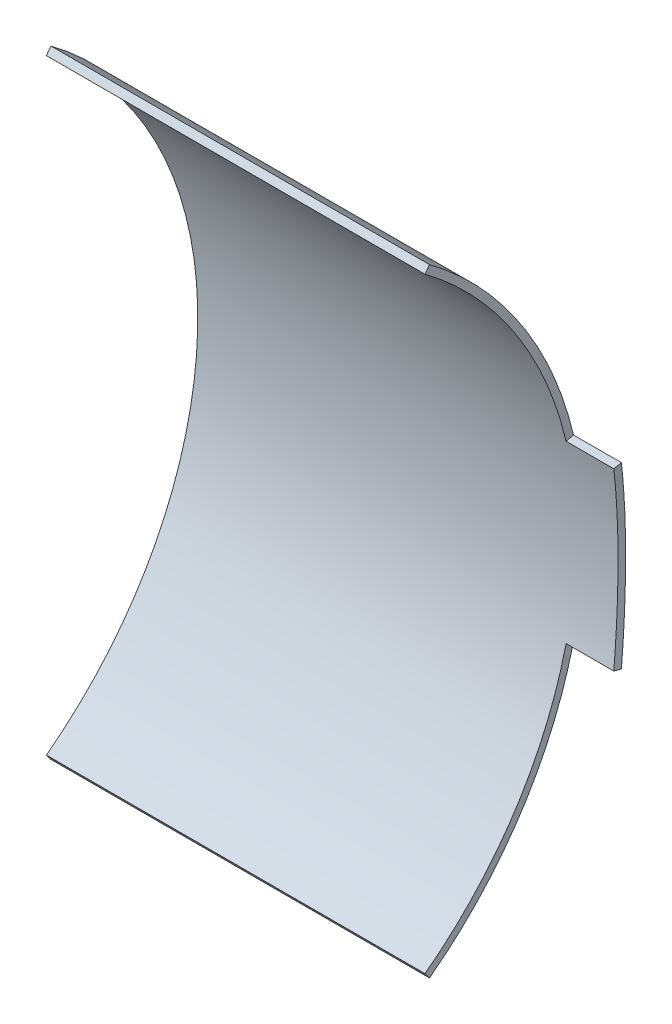
ISO-10303-21;
HEADER;
FILE_DESCRIPTION(('STEP AP214'),'2;1');
FILE_NAME('part.step','',(''),(''),'','','');
FILE_SCHEMA(('AUTOMOTIVE_DESIGN { 1 0 10303 214 1 1 1 1 }'));
ENDSEC;
DATA;
#1=APPLICATION_CONTEXT('core data for automotive mechanical design processes');
#2=APPLICATION_PROTOCOL_DEFINITION('international standard','automotive_design',2000,#1);
#3=PRODUCT_CONTEXT('',#1,'mechanical');
#4=PRODUCT('Part','Part','',(#3));
#5=PRODUCT_RELATED_PRODUCT_CATEGORY('part','',(#4));
#6=PRODUCT_DEFINITION_FORMATION('','',#4);
#7=PRODUCT_DEFINITION_CONTEXT('part definition',#1,'design');
#8=PRODUCT_DEFINITION('design','',#6,#7);
#9=PRODUCT_DEFINITION_SHAPE('','',#8);
#10=(LENGTH_UNIT() NAMED_UNIT(*) SI_UNIT(.MILLI.,.METRE.));
#11=(NAMED_UNIT(*) PLANE_ANGLE_UNIT() SI_UNIT($,.RADIAN.));
#12=(NAMED_UNIT(*) SI_UNIT($,.STERADIAN.) SOLID_ANGLE_UNIT());
#13=UNCERTAINTY_MEASURE_WITH_UNIT(LENGTH_MEASURE(1.E-05),#10,'distance_accuracy_value','');
#14=(GEOMETRIC_REPRESENTATION_CONTEXT(3) GLOBAL_UNCERTAINTY_ASSIGNED_CONTEXT((#13)) GLOBAL_UNIT_ASSIGNED_CONTEXT((#10,
#11,#12)) REPRESENTATION_CONTEXT('',''));
#15=CARTESIAN_POINT('',(0.,0.,0.));
#16=DIRECTION('',(0.,0.,1.));
#17=DIRECTION('',(1.,0.,0.));
#18=AXIS2_PLACEMENT_3D('',#15,#16,#17);
#19=CARTESIAN_POINT('',(50.,0.,0.));
#20=DIRECTION('',(-1.,0.,0.));
#21=DIRECTION('',(0.,0.,1.));
#22=AXIS2_PLACEMENT_3D('',#19,#20,#21);
#23=CYLINDRICAL_SURFACE('',#22,51.);
#24=CARTESIAN_POINT('',(0.,0.,0.));
#25=DIRECTION('',(0.999999999999989,0.,0.));
#26=DIRECTION('',(0.,0.,-0.999999999999977));
#27=AXIS2_PLACEMENT_3D('',#24,#25,#26);
#28=CIRCLE('',#27,51.);
#29=CARTESIAN_POINT('',(0.,40.7999999999999,-30.5999999999993));
#30=VERTEX_POINT('',#29);
#31=CARTESIAN_POINT('',(2.91433543964104E-13,-40.7999999999996,-30.5999999999991));
#32=VERTEX_POINT('',#31);
#33=EDGE_CURVE('E185',#30,#32,#28,.F.);
#34=ORIENTED_EDGE('',*,*,#33,.F.);
#35=DIRECTION('',(-1.,0.,0.));
#36=VECTOR('',#35,1.);
#37=CARTESIAN_POINT('',(50.0000000000001,40.7999999999999,-30.5999999999993));
#38=LINE('',#37,#36);
#39=CARTESIAN_POINT('',(50.0000000000001,40.7999999999999,-30.5999999999993));
#40=VERTEX_POINT('',#39);
#41=EDGE_CURVE('E11',#40,#30,#38,.T.);
#42=ORIENTED_EDGE('',*,*,#41,.F.);
#43=CARTESIAN_POINT('',(50.,0.,0.));
#44=DIRECTION('',(0.999999999999989,0.,0.));
#45=DIRECTION('',(0.,0.,-0.999999999999977));
#46=AXIS2_PLACEMENT_3D('',#43,#44,#45);
#47=CIRCLE('',#46,51.);
#48=CARTESIAN_POINT('',(50.0000000000007,11.8006085871643,-49.6159816689381));
#49=VERTEX_POINT('',#48);
#50=EDGE_CURVE('E58',#40,#49,#47,.F.);
#51=ORIENTED_EDGE('',*,*,#50,.T.);
#52=DIRECTION('',(-1.,0.,0.));
#53=VECTOR('',#52,1.);
#54=CARTESIAN_POINT('',(224.500651286366,11.8006085871643,-49.6159816689395));
#55=LINE('',#54,#53);
#56=CARTESIAN_POINT('',(56.3276987755479,11.8006085871643,-49.6159816689395));
#57=VERTEX_POINT('',#56);
#58=EDGE_CURVE('E147',#57,#49,#55,.T.);
#59=ORIENTED_EDGE('',*,*,#58,.F.);
#60=CARTESIAN_POINT('',(56.3276987755481,-11.8006085871644,-49.6159816689395));
#61=CARTESIAN_POINT('',(56.2421431199576,-11.1940659705682,-49.7602521474427));
#62=CARTESIAN_POINT('',(56.1628459242617,-10.5840304122179,-49.8935797907839));
#63=CARTESIAN_POINT('',(56.0171582342197,-9.35796245954004,-50.1379998242374));
#64=CARTESIAN_POINT('',(55.9507683875582,-8.74192976590719,-50.2490910985479));
#65=CARTESIAN_POINT('',(55.8312716591383,-7.50468799354155,-50.4487113181206));
#66=CARTESIAN_POINT('',(55.7781697186336,-6.88347707769742,-50.5372318704438));
#67=CARTESIAN_POINT('',(55.6855846962375,-5.63726599608254,-50.6913757109759));
#68=CARTESIAN_POINT('',(55.6461012656798,-5.01226592774009,-50.756999585395));
#69=CARTESIAN_POINT('',(55.5499154175328,-3.16134464214234,-50.9167508006822));
#70=CARTESIAN_POINT('',(55.5127607135739,-1.93137576886877,-50.978278339892));
#71=CARTESIAN_POINT('',(55.492354783328,0.52968578891808,-51.0120901535206));
#72=CARTESIAN_POINT('',(55.5090806036166,1.76077777158737,-50.9844124299102));
#73=CARTESIAN_POINT('',(55.5786656485458,3.72768868806815,-50.8689859282479));
#74=CARTESIAN_POINT('',(55.6145247443495,4.46591400384948,-50.8094792106459));
#75=CARTESIAN_POINT('',(55.7053130657657,5.93784336860939,-50.6585543397835));
#76=CARTESIAN_POINT('',(55.7602394135254,6.67154808289153,-50.5671410022323));
#77=CARTESIAN_POINT('',(55.8896183850118,8.14278758756847,-50.3513189568534));
#78=CARTESIAN_POINT('',(55.9643306769794,8.88023489819436,-50.2264711951656));
#79=CARTESIAN_POINT('',(56.1322804021036,10.3469903164566,-49.9449509305596));
#80=CARTESIAN_POINT('',(56.2255199187767,11.0762974989272,-49.788274848279));
#81=CARTESIAN_POINT('',(56.3276987755478,11.8006085871643,-49.6159816689395));
#82=B_SPLINE_CURVE_WITH_KNOTS('',3,(#60,#61,#62,#63,#64,#65,#66,#67,#68,#69,#70,#71,#72,#73,#74,
#75,#76,#77,#78,#79,#80,#81),.UNSPECIFIED.,.F.,.F.,(4,2,2,2,2,2,2,2,2,2,4),(0.,1.88779429643467,
3.77568329702008,5.66427329003176,7.55281492704589,11.2443286051451,14.9342698844242,
17.1578837929369,19.3811622334269,21.6352041159688,23.8894996249508),.UNSPECIFIED.);
#83=CARTESIAN_POINT('',(56.3276987755481,-11.8006085871644,-49.6159816689395));
#84=VERTEX_POINT('',#83);
#85=EDGE_CURVE('E160',#84,#57,#82,.T.);
#86=ORIENTED_EDGE('',*,*,#85,.F.);
#87=DIRECTION('',(-1.,0.,0.));
#88=VECTOR('',#87,1.);
#89=CARTESIAN_POINT('',(224.500651286366,-11.8006085871644,-49.6159816689395));
#90=LINE('',#89,#88);
#91=CARTESIAN_POINT('',(50.0000000000006,-11.8006085871644,-49.6159816689395));
#92=VERTEX_POINT('',#91);
#93=EDGE_CURVE('E113',#84,#92,#90,.T.);
#94=ORIENTED_EDGE('',*,*,#93,.T.);
#95=CARTESIAN_POINT('',(50.,0.,0.));
#96=DIRECTION('',(0.999999999999985,0.,0.));
#97=DIRECTION('',(0.,0.,-0.99999999999997));
#98=AXIS2_PLACEMENT_3D('',#95,#96,#97);
#99=CIRCLE('',#98,51.);
#100=CARTESIAN_POINT('',(50.0000000000003,-40.7999999999996,-30.5999999999991));
#101=VERTEX_POINT('',#100);
#102=EDGE_CURVE('E121',#92,#101,#99,.F.);
#103=ORIENTED_EDGE('',*,*,#102,.T.);
#104=DIRECTION('',(-1.,0.,0.));
#105=VECTOR('',#104,1.);
#106=CARTESIAN_POINT('',(50.0000000000003,-40.7999999999996,-30.5999999999991));
#107=LINE('',#106,#105);
#108=EDGE_CURVE('E129',#101,#32,#107,.T.);
#109=ORIENTED_EDGE('',*,*,#108,.T.);
#110=EDGE_LOOP('',(#34,#42,#51,#59,#86,#94,#103,#109));
#111=FACE_BOUND('',#110,.T.);
#112=ADVANCED_FACE('F35',(#111),#23,.T.);
#113=CARTESIAN_POINT('',(50.,0.,0.));
#114=DIRECTION('',(0.,-0.599999999999991,-0.800000000000007));
#115=DIRECTION('',(0.,0.800000000000007,-0.599999999999991));
#116=AXIS2_PLACEMENT_3D('',#113,#114,#115);
#117=PLANE('',#116);
#118=DIRECTION('',(0.,-0.799999999999989,0.599999999999977));
#119=VECTOR('',#118,1.);
#120=CARTESIAN_POINT('',(0.,0.,0.));
#121=LINE('',#120,#119);
#122=CARTESIAN_POINT('',(1.2490009027033E-12,40.,-29.9999999999993));
#123=VERTEX_POINT('',#122);
#124=EDGE_CURVE('E72',#30,#123,#121,.T.);
#125=ORIENTED_EDGE('',*,*,#124,.T.);
#126=DIRECTION('',(-1.,0.,0.));
#127=VECTOR('',#126,1.);
#128=CARTESIAN_POINT('',(50.0000000000013,40.,-29.9999999999993));
#129=LINE('',#128,#127);
#130=CARTESIAN_POINT('',(50.0000000000013,40.,-29.9999999999993));
#131=VERTEX_POINT('',#130);
#132=EDGE_CURVE('E42',#131,#123,#129,.T.);
#133=ORIENTED_EDGE('',*,*,#132,.F.);
#134=DIRECTION('',(0.,-0.799999999999989,0.599999999999977));
#135=VECTOR('',#134,1.);
#136=CARTESIAN_POINT('',(50.,0.,0.));
#137=LINE('',#136,#135);
#138=EDGE_CURVE('E204',#40,#131,#137,.T.);
#139=ORIENTED_EDGE('',*,*,#138,.F.);
#140=ORIENTED_EDGE('',*,*,#41,.T.);
#141=EDGE_LOOP('',(#125,#133,#139,#140));
#142=FACE_BOUND('',#141,.T.);
#143=ADVANCED_FACE('F178',(#142),#117,.F.);
#144=CARTESIAN_POINT('',(50.,0.,0.));
#145=DIRECTION('',(-1.,0.,0.));
#146=DIRECTION('',(0.,0.,1.));
#147=AXIS2_PLACEMENT_3D('',#144,#145,#146);
#148=CYLINDRICAL_SURFACE('',#147,50.);
#149=CARTESIAN_POINT('',(0.,0.,0.));
#150=DIRECTION('',(0.999999999999989,0.,0.));
#151=DIRECTION('',(0.,0.,-0.999999999999977));
#152=AXIS2_PLACEMENT_3D('',#149,#150,#151);
#153=CIRCLE('',#152,50.);
#154=CARTESIAN_POINT('',(7.91033905045424E-13,-39.9999999999983,-29.9999999999991));
#155=VERTEX_POINT('',#154);
#156=EDGE_CURVE('E189',#123,#155,#153,.F.);
#157=ORIENTED_EDGE('',*,*,#156,.T.);
#158=DIRECTION('',(-1.,0.,0.));
#159=VECTOR('',#158,1.);
#160=CARTESIAN_POINT('',(50.0000000000008,-39.9999999999983,-29.9999999999991));
#161=LINE('',#160,#159);
#162=CARTESIAN_POINT('',(50.0000000000008,-39.9999999999983,-29.9999999999991));
#163=VERTEX_POINT('',#162);
#164=EDGE_CURVE('E125',#163,#155,#161,.T.);
#165=ORIENTED_EDGE('',*,*,#164,.F.);
#166=CARTESIAN_POINT('',(50.,0.,0.));
#167=DIRECTION('',(0.999999999999985,0.,0.));
#168=DIRECTION('',(0.,0.,-0.99999999999997));
#169=AXIS2_PLACEMENT_3D('',#166,#167,#168);
#170=CIRCLE('',#169,50.);
#171=CARTESIAN_POINT('',(50.,-11.5692241050631,-48.6431192832731));
#172=VERTEX_POINT('',#171);
#173=EDGE_CURVE('E118',#172,#163,#170,.F.);
#174=ORIENTED_EDGE('',*,*,#173,.F.);
#175=DIRECTION('',(-1.,0.,0.));
#176=VECTOR('',#175,1.);
#177=CARTESIAN_POINT('',(224.500651286366,-11.5692241050631,-48.643119283274));
#178=LINE('',#177,#176);
#179=CARTESIAN_POINT('',(56.2953918152563,-11.5692241050631,-48.643119283274));
#180=VERTEX_POINT('',#179);
#181=EDGE_CURVE('E106',#180,#172,#178,.T.);
#182=ORIENTED_EDGE('',*,*,#181,.F.);
#183=CARTESIAN_POINT('',(56.2953918152563,-11.5692241050631,-48.643119283274));
#184=CARTESIAN_POINT('',(56.2127679159269,-10.9715214594329,-48.7852870523578));
#185=CARTESIAN_POINT('',(56.1362188044471,-10.3703922739998,-48.9166084508953));
#186=CARTESIAN_POINT('',(55.9956493247559,-9.16225868018498,-49.1572185707781));
#187=CARTESIAN_POINT('',(55.9316295725808,-8.55525398445877,-49.2665062087883));
#188=CARTESIAN_POINT('',(55.8164847539788,-7.33617937168457,-49.4627313353402));
#189=CARTESIAN_POINT('',(55.7653644955207,-6.72410765355895,-49.5496604905399));
#190=CARTESIAN_POINT('',(55.6763442583041,-5.49626738041369,-49.7008429541383));
#191=CARTESIAN_POINT('',(55.638443944173,-4.88049891957869,-49.765096837779));
#192=CARTESIAN_POINT('',(55.5463281353762,-3.05682738883748,-49.9211502369828));
#193=CARTESIAN_POINT('',(55.5110934806901,-1.84498829374821,-49.9806618060144));
#194=CARTESIAN_POINT('',(55.492946044353,0.579655268033867,-50.0113325363258));
#195=CARTESIAN_POINT('',(55.5100107786606,1.79245909584915,-49.9825296648825));
#196=CARTESIAN_POINT('',(55.5785271105826,3.72051619942554,-49.8665934124131));
#197=CARTESIAN_POINT('',(55.613240404057,4.43822070362231,-49.8078295902442));
#198=CARTESIAN_POINT('',(55.7006872600454,5.86926647820589,-49.659530423241));
#199=CARTESIAN_POINT('',(55.7534180337371,6.58260840646759,-49.5699998406048));
#200=CARTESIAN_POINT('',(55.8773282915852,8.01291678827752,-49.3591199231692));
#201=CARTESIAN_POINT('',(55.94874863048,8.72980086865326,-49.237354921753));
#202=CARTESIAN_POINT('',(56.1090924324633,10.1557890404748,-48.9631262070227));
#203=CARTESIAN_POINT('',(56.1980179628926,10.8648922025514,-48.8106588677532));
#204=CARTESIAN_POINT('',(56.2953918152561,11.5692241050631,-48.643119283274));
#205=B_SPLINE_CURVE_WITH_KNOTS('',3,(#183,#184,#185,#186,#187,#188,#189,#190,#191,#192,#193,
#194,#195,#196,#197,#198,#199,#200,#201,#202,#203,#204),.UNSPECIFIED.,.F.,.F.,(4,2,2,2,2,2,2,2,
2,2,4),(0.,1.85959983934922,3.71929108745296,5.5796744692453,7.44001065214895,11.0768286552742,
14.7120833725647,16.8741113037857,19.0358047385885,21.2268597719166,23.4181737214368),.UNSPECIFIED.);
#206=CARTESIAN_POINT('',(56.2953918152561,11.5692241050631,-48.643119283274));
#207=VERTEX_POINT('',#206);
#208=EDGE_CURVE('E139',#180,#207,#205,.T.);
#209=ORIENTED_EDGE('',*,*,#208,.T.);
#210=DIRECTION('',(-1.,0.,0.));
#211=VECTOR('',#210,1.);
#212=CARTESIAN_POINT('',(224.500651286366,11.5692241050631,-48.6431192832741));
#213=LINE('',#212,#211);
#214=CARTESIAN_POINT('',(50.000000000001,11.5692241050631,-48.6431192832741));
#215=VERTEX_POINT('',#214);
#216=EDGE_CURVE('E112',#207,#215,#213,.T.);
#217=ORIENTED_EDGE('',*,*,#216,.T.);
#218=CARTESIAN_POINT('',(50.,0.,0.));
#219=DIRECTION('',(0.999999999999989,0.,0.));
#220=DIRECTION('',(0.,0.,-0.999999999999977));
#221=AXIS2_PLACEMENT_3D('',#218,#219,#220);
#222=CIRCLE('',#221,50.);
#223=EDGE_CURVE('E199',#131,#215,#222,.F.);
#224=ORIENTED_EDGE('',*,*,#223,.F.);
#225=ORIENTED_EDGE('',*,*,#132,.T.);
#226=EDGE_LOOP('',(#157,#165,#174,#182,#209,#217,#224,#225));
#227=FACE_BOUND('',#226,.T.);
#228=ADVANCED_FACE('F123',(#227),#148,.F.);
#229=CARTESIAN_POINT('',(50.,0.,0.));
#230=DIRECTION('',(0.999999999999989,0.,0.));
#231=DIRECTION('',(0.,0.,-0.999999999999977));
#232=AXIS2_PLACEMENT_3D('',#229,#230,#231);
#233=PLANE('',#232);
#234=ORIENTED_EDGE('',*,*,#50,.F.);
#235=ORIENTED_EDGE('',*,*,#138,.T.);
#236=ORIENTED_EDGE('',*,*,#223,.T.);
#237=DIRECTION('',(0.,-0.231384482101262,0.972862385665458));
#238=VECTOR('',#237,1.);
#239=CARTESIAN_POINT('',(50.,0.,0.));
#240=LINE('',#239,#238);
#241=EDGE_CURVE('E193',#49,#215,#240,.T.);
#242=ORIENTED_EDGE('',*,*,#241,.F.);
#243=EDGE_LOOP('',(#234,#235,#236,#242));
#244=FACE_BOUND('',#243,.T.);
#245=ADVANCED_FACE('F169',(#244),#233,.T.);
#246=CARTESIAN_POINT('',(0.,0.,0.));
#247=DIRECTION('',(0.999999999999989,0.,0.));
#248=DIRECTION('',(0.,0.,-0.999999999999977));
#249=AXIS2_PLACEMENT_3D('',#246,#247,#248);
#250=PLANE('',#249);
#251=ORIENTED_EDGE('',*,*,#33,.T.);
#252=DIRECTION('',(0.,-0.799999999999985,-0.59999999999997));
#253=VECTOR('',#252,1.);
#254=CARTESIAN_POINT('',(0.,0.,0.));
#255=LINE('',#254,#253);
#256=EDGE_CURVE('E133',#155,#32,#255,.T.);
#257=ORIENTED_EDGE('',*,*,#256,.F.);
#258=ORIENTED_EDGE('',*,*,#156,.F.);
#259=ORIENTED_EDGE('',*,*,#124,.F.);
#260=EDGE_LOOP('',(#251,#257,#258,#259));
#261=FACE_BOUND('',#260,.T.);
#262=ADVANCED_FACE('F172',(#261),#250,.F.);
#263=CARTESIAN_POINT('',(224.500651286366,0.,0.));
#264=DIRECTION('',(0.,-0.972862385665481,-0.231384482101262));
#265=DIRECTION('',(0.,0.231384482101262,-0.972862385665481));
#266=AXIS2_PLACEMENT_3D('',#263,#264,#265);
#267=PLANE('',#266);
#268=ORIENTED_EDGE('',*,*,#58,.T.);
#269=ORIENTED_EDGE('',*,*,#241,.T.);
#270=ORIENTED_EDGE('',*,*,#216,.F.);
#271=CARTESIAN_POINT('',(139.999651286366,7.48801228222595E-13,-3.21964677141295E-12));
#272=DIRECTION('',(0.,-0.972862385665481,-0.231384482101262));
#273=DIRECTION('',(0.,0.231384482101262,-0.972862385665481));
#274=AXIS2_PLACEMENT_3D('',#271,#272,#273);
#275=ELLIPSE('',#274,365.193029509299,84.5);
#276=EDGE_CURVE('E146',#207,#57,#275,.T.);
#277=ORIENTED_EDGE('',*,*,#276,.T.);
#278=EDGE_LOOP('',(#268,#269,#270,#277));
#279=FACE_BOUND('',#278,.T.);
#280=ADVANCED_FACE('F168',(#279),#267,.F.);
#281=CARTESIAN_POINT('',(224.500651286366,0.,0.));
#282=DIRECTION('',(0.,-0.972862385665481,0.231384482101262));
#283=DIRECTION('',(0.,-0.231384482101262,-0.972862385665481));
#284=AXIS2_PLACEMENT_3D('',#281,#282,#283);
#285=PLANE('',#284);
#286=DIRECTION('',(0.,0.231384482101254,0.972862385665451));
#287=VECTOR('',#286,1.);
#288=CARTESIAN_POINT('',(50.,0.,0.));
#289=LINE('',#288,#287);
#290=EDGE_CURVE('E49',#92,#172,#289,.T.);
#291=ORIENTED_EDGE('',*,*,#290,.F.);
#292=ORIENTED_EDGE('',*,*,#93,.F.);
#293=CARTESIAN_POINT('',(139.999651286366,7.48801228222595E-13,3.21964677141295E-12));
#294=DIRECTION('',(0.,-0.972862385665481,0.231384482101262));
#295=DIRECTION('',(0.,-0.231384482101262,-0.972862385665481));
#296=AXIS2_PLACEMENT_3D('',#293,#294,#295);
#297=ELLIPSE('',#296,365.193029509298,84.5);
#298=EDGE_CURVE('E108',#180,#84,#297,.T.);
#299=ORIENTED_EDGE('',*,*,#298,.F.);
#300=ORIENTED_EDGE('',*,*,#181,.T.);
#301=EDGE_LOOP('',(#291,#292,#299,#300));
#302=FACE_BOUND('',#301,.T.);
#303=ADVANCED_FACE('F107',(#302),#285,.T.);
#304=CARTESIAN_POINT('',(139.999651286366,8.20722004671177E-13,-874.32));
#305=DIRECTION('',(0.,0.,-1.));
#306=DIRECTION('',(-0.707106781186546,0.707106781186549,0.));
#307=AXIS2_PLACEMENT_3D('',#304,#305,#306);
#308=CYLINDRICAL_SURFACE('',#307,84.5);
#309=ORIENTED_EDGE('',*,*,#85,.T.);
#310=ORIENTED_EDGE('',*,*,#276,.F.);
#311=ORIENTED_EDGE('',*,*,#208,.F.);
#312=ORIENTED_EDGE('',*,*,#298,.T.);
#313=EDGE_LOOP('',(#309,#310,#311,#312));
#314=FACE_BOUND('',#313,.T.);
#315=ADVANCED_FACE('F152',(#314),#308,.F.);
#316=CARTESIAN_POINT('',(50.,0.,0.));
#317=DIRECTION('',(0.,0.599999999999988,-0.800000000000009));
#318=DIRECTION('',(0.,0.800000000000009,0.599999999999988));
#319=AXIS2_PLACEMENT_3D('',#316,#317,#318);
#320=PLANE('',#319);
#321=ORIENTED_EDGE('',*,*,#256,.T.);
#322=ORIENTED_EDGE('',*,*,#108,.F.);
#323=DIRECTION('',(0.,-0.799999999999985,-0.59999999999997));
#324=VECTOR('',#323,1.);
#325=CARTESIAN_POINT('',(50.,0.,0.));
#326=LINE('',#325,#324);
#327=EDGE_CURVE('E127',#163,#101,#326,.T.);
#328=ORIENTED_EDGE('',*,*,#327,.F.);
#329=ORIENTED_EDGE('',*,*,#164,.T.);
#330=EDGE_LOOP('',(#321,#322,#328,#329));
#331=FACE_BOUND('',#330,.T.);
#332=ADVANCED_FACE('F156',(#331),#320,.F.);
#333=CARTESIAN_POINT('',(50.,0.,0.));
#334=DIRECTION('',(0.999999999999985,0.,0.));
#335=DIRECTION('',(0.,0.,-0.99999999999997));
#336=AXIS2_PLACEMENT_3D('',#333,#334,#335);
#337=PLANE('',#336);
#338=ORIENTED_EDGE('',*,*,#102,.F.);
#339=ORIENTED_EDGE('',*,*,#290,.T.);
#340=ORIENTED_EDGE('',*,*,#173,.T.);
#341=ORIENTED_EDGE('',*,*,#327,.T.);
#342=EDGE_LOOP('',(#338,#339,#340,#341));
#343=FACE_BOUND('',#342,.T.);
#344=ADVANCED_FACE('F117',(#343),#337,.T.);
#345=CLOSED_SHELL('',(#112,#143,#228,#245,#262,#280,#303,#315,#332,#344));
#346=MANIFOLD_SOLID_BREP('B2',#345);
#347=ADVANCED_BREP_SHAPE_REPRESENTATION('',(#18,#346),#14);
#348=SHAPE_DEFINITION_REPRESENTATION(#9,#347);
ENDSEC;
END-ISO-10303-21;
